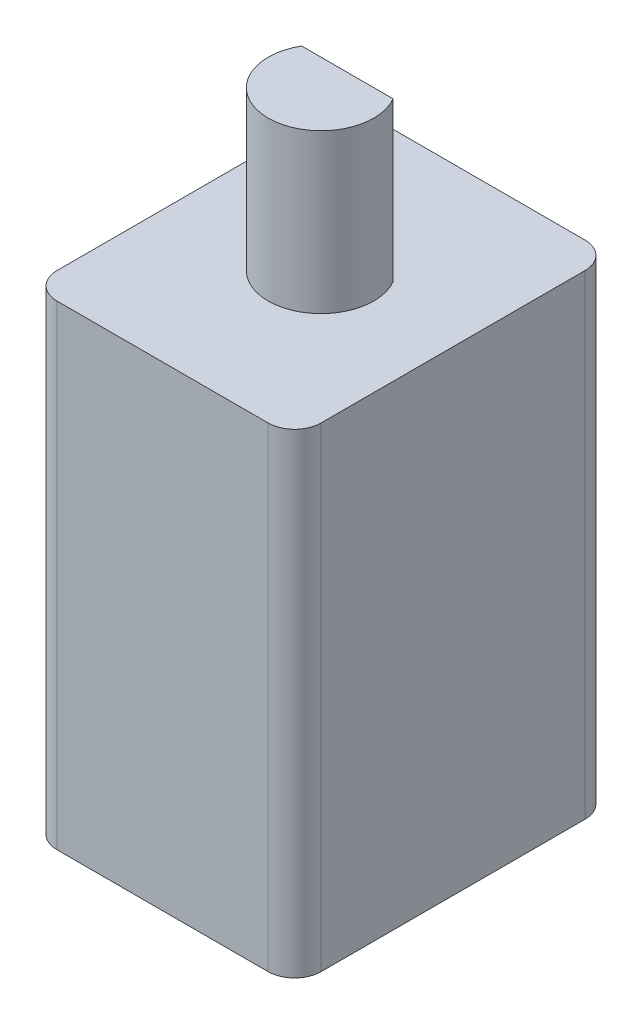
ISO-10303-21;
HEADER;
FILE_DESCRIPTION(('STEP AP214'),'2;1');
FILE_NAME('part.step','',(''),(''),'','','');
FILE_SCHEMA(('AUTOMOTIVE_DESIGN { 1 0 10303 214 1 1 1 1 }'));
ENDSEC;
DATA;
#1=APPLICATION_CONTEXT('core data for automotive mechanical design processes');
#2=APPLICATION_PROTOCOL_DEFINITION('international standard','automotive_design',2000,#1);
#3=PRODUCT_CONTEXT('',#1,'mechanical');
#4=PRODUCT('Part','Part','',(#3));
#5=PRODUCT_RELATED_PRODUCT_CATEGORY('part','',(#4));
#6=PRODUCT_DEFINITION_FORMATION('','',#4);
#7=PRODUCT_DEFINITION_CONTEXT('part definition',#1,'design');
#8=PRODUCT_DEFINITION('design','',#6,#7);
#9=PRODUCT_DEFINITION_SHAPE('','',#8);
#10=(LENGTH_UNIT() NAMED_UNIT(*) SI_UNIT(.MILLI.,.METRE.));
#11=(NAMED_UNIT(*) PLANE_ANGLE_UNIT() SI_UNIT($,.RADIAN.));
#12=(NAMED_UNIT(*) SI_UNIT($,.STERADIAN.) SOLID_ANGLE_UNIT());
#13=UNCERTAINTY_MEASURE_WITH_UNIT(LENGTH_MEASURE(1.E-05),#10,'distance_accuracy_value','');
#14=(GEOMETRIC_REPRESENTATION_CONTEXT(3) GLOBAL_UNCERTAINTY_ASSIGNED_CONTEXT((#13)) GLOBAL_UNIT_ASSIGNED_CONTEXT((#10,
#11,#12)) REPRESENTATION_CONTEXT('',''));
#15=CARTESIAN_POINT('',(0.,0.,0.));
#16=DIRECTION('',(0.,0.,1.));
#17=DIRECTION('',(1.,0.,0.));
#18=AXIS2_PLACEMENT_3D('',#15,#16,#17);
#19=CARTESIAN_POINT('',(0.,18.,0.));
#20=DIRECTION('',(0.,1.,0.));
#21=DIRECTION('',(0.,0.,1.));
#22=AXIS2_PLACEMENT_3D('',#19,#20,#21);
#23=PLANE('',#22);
#24=DIRECTION('',(-1.,0.,0.));
#25=VECTOR('',#24,1.);
#26=CARTESIAN_POINT('',(-5.,18.,-6.));
#27=LINE('',#26,#25);
#28=CARTESIAN_POINT('',(4.,18.,-6.));
#29=VERTEX_POINT('',#28);
#30=CARTESIAN_POINT('',(-4.,18.,-6.));
#31=VERTEX_POINT('',#30);
#32=EDGE_CURVE('E146',#29,#31,#27,.T.);
#33=ORIENTED_EDGE('',*,*,#32,.T.);
#34=CARTESIAN_POINT('',(-4.,18.,-5.));
#35=DIRECTION('',(0.,1.,0.));
#36=DIRECTION('',(0.,0.,1.));
#37=AXIS2_PLACEMENT_3D('',#34,#35,#36);
#38=CIRCLE('',#37,1.);
#39=CARTESIAN_POINT('',(-5.,18.,-5.));
#40=VERTEX_POINT('',#39);
#41=EDGE_CURVE('E183',#31,#40,#38,.T.);
#42=ORIENTED_EDGE('',*,*,#41,.T.);
#43=DIRECTION('',(0.,0.,1.));
#44=VECTOR('',#43,1.);
#45=CARTESIAN_POINT('',(-5.,18.,-6.));
#46=LINE('',#45,#44);
#47=CARTESIAN_POINT('',(-5.,18.,5.));
#48=VERTEX_POINT('',#47);
#49=EDGE_CURVE('E150',#40,#48,#46,.T.);
#50=ORIENTED_EDGE('',*,*,#49,.T.);
#51=CARTESIAN_POINT('',(-4.,18.,5.));
#52=DIRECTION('',(0.,1.,0.));
#53=DIRECTION('',(0.,0.,1.));
#54=AXIS2_PLACEMENT_3D('',#51,#52,#53);
#55=CIRCLE('',#54,1.);
#56=CARTESIAN_POINT('',(-4.,18.,6.));
#57=VERTEX_POINT('',#56);
#58=EDGE_CURVE('E59',#48,#57,#55,.T.);
#59=ORIENTED_EDGE('',*,*,#58,.T.);
#60=DIRECTION('',(1.,0.,0.));
#61=VECTOR('',#60,1.);
#62=CARTESIAN_POINT('',(-5.,18.,6.));
#63=LINE('',#62,#61);
#64=CARTESIAN_POINT('',(4.,18.,6.));
#65=VERTEX_POINT('',#64);
#66=EDGE_CURVE('E152',#57,#65,#63,.T.);
#67=ORIENTED_EDGE('',*,*,#66,.T.);
#68=CARTESIAN_POINT('',(4.,18.,5.));
#69=DIRECTION('',(0.,1.,0.));
#70=DIRECTION('',(0.,0.,1.));
#71=AXIS2_PLACEMENT_3D('',#68,#69,#70);
#72=CIRCLE('',#71,1.);
#73=CARTESIAN_POINT('',(5.,18.,5.));
#74=VERTEX_POINT('',#73);
#75=EDGE_CURVE('E178',#65,#74,#72,.T.);
#76=ORIENTED_EDGE('',*,*,#75,.T.);
#77=DIRECTION('',(0.,0.,-1.));
#78=VECTOR('',#77,1.);
#79=CARTESIAN_POINT('',(5.,18.,-6.));
#80=LINE('',#79,#78);
#81=CARTESIAN_POINT('',(5.,18.,-5.));
#82=VERTEX_POINT('',#81);
#83=EDGE_CURVE('E143',#74,#82,#80,.T.);
#84=ORIENTED_EDGE('',*,*,#83,.T.);
#85=CARTESIAN_POINT('',(4.,18.,-5.));
#86=DIRECTION('',(0.,1.,0.));
#87=DIRECTION('',(0.,0.,1.));
#88=AXIS2_PLACEMENT_3D('',#85,#86,#87);
#89=CIRCLE('',#88,1.);
#90=EDGE_CURVE('E181',#82,#29,#89,.T.);
#91=ORIENTED_EDGE('',*,*,#90,.T.);
#92=EDGE_LOOP('',(#33,#42,#50,#59,#67,#76,#84,#91));
#93=FACE_BOUND('',#92,.T.);
#94=DIRECTION('',(-1.,0.,0.));
#95=VECTOR('',#94,1.);
#96=CARTESIAN_POINT('',(-1.73205080756888,18.,-1.));
#97=LINE('',#96,#95);
#98=CARTESIAN_POINT('',(1.73205080756888,18.,-1.));
#99=VERTEX_POINT('',#98);
#100=CARTESIAN_POINT('',(-1.73205080756888,18.,-1.));
#101=VERTEX_POINT('',#100);
#102=EDGE_CURVE('E130',#99,#101,#97,.T.);
#103=ORIENTED_EDGE('',*,*,#102,.F.);
#104=CARTESIAN_POINT('',(0.,18.,0.));
#105=DIRECTION('',(0.,1.,0.));
#106=DIRECTION('',(0.,0.,1.));
#107=AXIS2_PLACEMENT_3D('',#104,#105,#106);
#108=CIRCLE('',#107,2.);
#109=EDGE_CURVE('E134',#101,#99,#108,.T.);
#110=ORIENTED_EDGE('',*,*,#109,.F.);
#111=EDGE_LOOP('',(#103,#110));
#112=FACE_BOUND('',#111,.T.);
#113=ADVANCED_FACE('F38',(#93,#112),#23,.T.);
#114=CARTESIAN_POINT('',(5.,18.,-6.));
#115=DIRECTION('',(-1.,0.,0.));
#116=DIRECTION('',(0.,0.,1.));
#117=AXIS2_PLACEMENT_3D('',#114,#115,#116);
#118=PLANE('',#117);
#119=DIRECTION('',(0.,0.,-1.));
#120=VECTOR('',#119,1.);
#121=CARTESIAN_POINT('',(5.,0.,-6.));
#122=LINE('',#121,#120);
#123=CARTESIAN_POINT('',(5.,0.,5.));
#124=VERTEX_POINT('',#123);
#125=CARTESIAN_POINT('',(5.,0.,-5.));
#126=VERTEX_POINT('',#125);
#127=EDGE_CURVE('E135',#124,#126,#122,.T.);
#128=ORIENTED_EDGE('',*,*,#127,.T.);
#129=DIRECTION('',(0.,-1.,0.));
#130=VECTOR('',#129,1.);
#131=CARTESIAN_POINT('',(5.,18.,-5.));
#132=LINE('',#131,#130);
#133=EDGE_CURVE('E188',#126,#82,#132,.F.);
#134=ORIENTED_EDGE('',*,*,#133,.T.);
#135=ORIENTED_EDGE('',*,*,#83,.F.);
#136=DIRECTION('',(0.,-1.,0.));
#137=VECTOR('',#136,1.);
#138=CARTESIAN_POINT('',(5.,18.,5.));
#139=LINE('',#138,#137);
#140=EDGE_CURVE('E185',#74,#124,#139,.T.);
#141=ORIENTED_EDGE('',*,*,#140,.T.);
#142=EDGE_LOOP('',(#128,#134,#135,#141));
#143=FACE_BOUND('',#142,.T.);
#144=ADVANCED_FACE('F192',(#143),#118,.F.);
#145=CARTESIAN_POINT('',(-5.,18.,-6.));
#146=DIRECTION('',(0.,0.,1.));
#147=DIRECTION('',(1.,0.,0.));
#148=AXIS2_PLACEMENT_3D('',#145,#146,#147);
#149=PLANE('',#148);
#150=DIRECTION('',(-1.,0.,0.));
#151=VECTOR('',#150,1.);
#152=CARTESIAN_POINT('',(-5.,0.,-6.));
#153=LINE('',#152,#151);
#154=CARTESIAN_POINT('',(4.,0.,-6.));
#155=VERTEX_POINT('',#154);
#156=CARTESIAN_POINT('',(-4.,0.,-6.));
#157=VERTEX_POINT('',#156);
#158=EDGE_CURVE('E138',#155,#157,#153,.T.);
#159=ORIENTED_EDGE('',*,*,#158,.T.);
#160=DIRECTION('',(0.,-1.,0.));
#161=VECTOR('',#160,1.);
#162=CARTESIAN_POINT('',(-4.,18.,-6.));
#163=LINE('',#162,#161);
#164=EDGE_CURVE('E176',#157,#31,#163,.F.);
#165=ORIENTED_EDGE('',*,*,#164,.T.);
#166=ORIENTED_EDGE('',*,*,#32,.F.);
#167=DIRECTION('',(0.,-1.,0.));
#168=VECTOR('',#167,1.);
#169=CARTESIAN_POINT('',(4.,18.,-6.));
#170=LINE('',#169,#168);
#171=EDGE_CURVE('E173',#29,#155,#170,.T.);
#172=ORIENTED_EDGE('',*,*,#171,.T.);
#173=EDGE_LOOP('',(#159,#165,#166,#172));
#174=FACE_BOUND('',#173,.T.);
#175=ADVANCED_FACE('F204',(#174),#149,.F.);
#176=CARTESIAN_POINT('',(-5.,18.,-6.));
#177=DIRECTION('',(1.,0.,0.));
#178=DIRECTION('',(0.,0.,-1.));
#179=AXIS2_PLACEMENT_3D('',#176,#177,#178);
#180=PLANE('',#179);
#181=ORIENTED_EDGE('',*,*,#49,.F.);
#182=DIRECTION('',(0.,-1.,0.));
#183=VECTOR('',#182,1.);
#184=CARTESIAN_POINT('',(-5.,18.,-5.));
#185=LINE('',#184,#183);
#186=CARTESIAN_POINT('',(-5.,0.,-5.));
#187=VERTEX_POINT('',#186);
#188=EDGE_CURVE('E162',#40,#187,#185,.T.);
#189=ORIENTED_EDGE('',*,*,#188,.T.);
#190=DIRECTION('',(0.,0.,1.));
#191=VECTOR('',#190,1.);
#192=CARTESIAN_POINT('',(-5.,0.,-6.));
#193=LINE('',#192,#191);
#194=CARTESIAN_POINT('',(-5.,0.,5.));
#195=VERTEX_POINT('',#194);
#196=EDGE_CURVE('E157',#187,#195,#193,.T.);
#197=ORIENTED_EDGE('',*,*,#196,.T.);
#198=DIRECTION('',(0.,-1.,0.));
#199=VECTOR('',#198,1.);
#200=CARTESIAN_POINT('',(-5.,18.,5.));
#201=LINE('',#200,#199);
#202=EDGE_CURVE('E153',#195,#48,#201,.F.);
#203=ORIENTED_EDGE('',*,*,#202,.T.);
#204=EDGE_LOOP('',(#181,#189,#197,#203));
#205=FACE_BOUND('',#204,.T.);
#206=ADVANCED_FACE('F215',(#205),#180,.F.);
#207=CARTESIAN_POINT('',(-5.,18.,6.));
#208=DIRECTION('',(0.,0.,-1.));
#209=DIRECTION('',(-1.,0.,0.));
#210=AXIS2_PLACEMENT_3D('',#207,#208,#209);
#211=PLANE('',#210);
#212=ORIENTED_EDGE('',*,*,#66,.F.);
#213=DIRECTION('',(0.,-1.,0.));
#214=VECTOR('',#213,1.);
#215=CARTESIAN_POINT('',(-4.,18.,6.));
#216=LINE('',#215,#214);
#217=CARTESIAN_POINT('',(-4.,0.,6.));
#218=VERTEX_POINT('',#217);
#219=EDGE_CURVE('E11',#57,#218,#216,.T.);
#220=ORIENTED_EDGE('',*,*,#219,.T.);
#221=DIRECTION('',(1.,0.,0.));
#222=VECTOR('',#221,1.);
#223=CARTESIAN_POINT('',(-5.,0.,6.));
#224=LINE('',#223,#222);
#225=CARTESIAN_POINT('',(4.,0.,6.));
#226=VERTEX_POINT('',#225);
#227=EDGE_CURVE('E147',#218,#226,#224,.T.);
#228=ORIENTED_EDGE('',*,*,#227,.T.);
#229=DIRECTION('',(0.,-1.,0.));
#230=VECTOR('',#229,1.);
#231=CARTESIAN_POINT('',(4.,18.,6.));
#232=LINE('',#231,#230);
#233=EDGE_CURVE('E46',#226,#65,#232,.F.);
#234=ORIENTED_EDGE('',*,*,#233,.T.);
#235=EDGE_LOOP('',(#212,#220,#228,#234));
#236=FACE_BOUND('',#235,.T.);
#237=ADVANCED_FACE('F221',(#236),#211,.F.);
#238=CARTESIAN_POINT('',(0.,0.,0.));
#239=DIRECTION('',(0.,1.,0.));
#240=DIRECTION('',(0.,0.,1.));
#241=AXIS2_PLACEMENT_3D('',#238,#239,#240);
#242=PLANE('',#241);
#243=ORIENTED_EDGE('',*,*,#196,.F.);
#244=CARTESIAN_POINT('',(-4.,0.,-5.));
#245=DIRECTION('',(0.,1.,0.));
#246=DIRECTION('',(0.,0.,1.));
#247=AXIS2_PLACEMENT_3D('',#244,#245,#246);
#248=CIRCLE('',#247,1.);
#249=EDGE_CURVE('E171',#187,#157,#248,.F.);
#250=ORIENTED_EDGE('',*,*,#249,.T.);
#251=ORIENTED_EDGE('',*,*,#158,.F.);
#252=CARTESIAN_POINT('',(4.,0.,-5.));
#253=DIRECTION('',(0.,1.,0.));
#254=DIRECTION('',(0.,0.,1.));
#255=AXIS2_PLACEMENT_3D('',#252,#253,#254);
#256=CIRCLE('',#255,1.);
#257=EDGE_CURVE('E169',#155,#126,#256,.F.);
#258=ORIENTED_EDGE('',*,*,#257,.T.);
#259=ORIENTED_EDGE('',*,*,#127,.F.);
#260=CARTESIAN_POINT('',(4.,0.,5.));
#261=DIRECTION('',(0.,1.,0.));
#262=DIRECTION('',(0.,0.,1.));
#263=AXIS2_PLACEMENT_3D('',#260,#261,#262);
#264=CIRCLE('',#263,1.);
#265=EDGE_CURVE('E165',#124,#226,#264,.F.);
#266=ORIENTED_EDGE('',*,*,#265,.T.);
#267=ORIENTED_EDGE('',*,*,#227,.F.);
#268=CARTESIAN_POINT('',(-4.,0.,5.));
#269=DIRECTION('',(0.,1.,0.));
#270=DIRECTION('',(0.,0.,1.));
#271=AXIS2_PLACEMENT_3D('',#268,#269,#270);
#272=CIRCLE('',#271,1.);
#273=EDGE_CURVE('E167',#218,#195,#272,.F.);
#274=ORIENTED_EDGE('',*,*,#273,.T.);
#275=EDGE_LOOP('',(#243,#250,#251,#258,#259,#266,#267,#274));
#276=FACE_BOUND('',#275,.T.);
#277=ADVANCED_FACE('F208',(#276),#242,.F.);
#278=CARTESIAN_POINT('',(0.,24.,0.));
#279=DIRECTION('',(0.,-1.,0.));
#280=DIRECTION('',(0.,0.,-1.));
#281=AXIS2_PLACEMENT_3D('',#278,#279,#280);
#282=CYLINDRICAL_SURFACE('',#281,2.);
#283=ORIENTED_EDGE('',*,*,#109,.T.);
#284=DIRECTION('',(0.,-1.,0.));
#285=VECTOR('',#284,1.);
#286=CARTESIAN_POINT('',(1.73205080756888,24.,-1.));
#287=LINE('',#286,#285);
#288=CARTESIAN_POINT('',(1.73205080756888,24.,-1.));
#289=VERTEX_POINT('',#288);
#290=EDGE_CURVE('E120',#289,#99,#287,.T.);
#291=ORIENTED_EDGE('',*,*,#290,.F.);
#292=CARTESIAN_POINT('',(0.,24.,0.));
#293=DIRECTION('',(0.,1.,0.));
#294=DIRECTION('',(0.,0.,1.));
#295=AXIS2_PLACEMENT_3D('',#292,#293,#294);
#296=CIRCLE('',#295,2.);
#297=CARTESIAN_POINT('',(-1.73205080756888,24.,-1.));
#298=VERTEX_POINT('',#297);
#299=EDGE_CURVE('E126',#298,#289,#296,.T.);
#300=ORIENTED_EDGE('',*,*,#299,.F.);
#301=DIRECTION('',(0.,-1.,0.));
#302=VECTOR('',#301,1.);
#303=CARTESIAN_POINT('',(-1.73205080756888,24.,-1.));
#304=LINE('',#303,#302);
#305=EDGE_CURVE('E123',#298,#101,#304,.T.);
#306=ORIENTED_EDGE('',*,*,#305,.T.);
#307=EDGE_LOOP('',(#283,#291,#300,#306));
#308=FACE_BOUND('',#307,.T.);
#309=ADVANCED_FACE('F132',(#308),#282,.T.);
#310=CARTESIAN_POINT('',(-1.73205080756888,24.,-1.));
#311=DIRECTION('',(0.,0.,1.));
#312=DIRECTION('',(1.,0.,0.));
#313=AXIS2_PLACEMENT_3D('',#310,#311,#312);
#314=PLANE('',#313);
#315=ORIENTED_EDGE('',*,*,#102,.T.);
#316=ORIENTED_EDGE('',*,*,#305,.F.);
#317=DIRECTION('',(-1.,0.,0.));
#318=VECTOR('',#317,1.);
#319=CARTESIAN_POINT('',(-1.73205080756888,24.,-1.));
#320=LINE('',#319,#318);
#321=EDGE_CURVE('E116',#289,#298,#320,.T.);
#322=ORIENTED_EDGE('',*,*,#321,.F.);
#323=ORIENTED_EDGE('',*,*,#290,.T.);
#324=EDGE_LOOP('',(#315,#316,#322,#323));
#325=FACE_BOUND('',#324,.T.);
#326=ADVANCED_FACE('F118',(#325),#314,.F.);
#327=CARTESIAN_POINT('',(0.,24.,0.));
#328=DIRECTION('',(0.,1.,0.));
#329=DIRECTION('',(0.,0.,1.));
#330=AXIS2_PLACEMENT_3D('',#327,#328,#329);
#331=PLANE('',#330);
#332=ORIENTED_EDGE('',*,*,#299,.T.);
#333=ORIENTED_EDGE('',*,*,#321,.T.);
#334=EDGE_LOOP('',(#332,#333));
#335=FACE_BOUND('',#334,.T.);
#336=ADVANCED_FACE('F128',(#335),#331,.T.);
#337=CARTESIAN_POINT('',(-4.,18.,-5.));
#338=DIRECTION('',(0.,-1.,0.));
#339=DIRECTION('',(0.,0.,-1.));
#340=AXIS2_PLACEMENT_3D('',#337,#338,#339);
#341=CYLINDRICAL_SURFACE('',#340,1.);
#342=ORIENTED_EDGE('',*,*,#41,.F.);
#343=ORIENTED_EDGE('',*,*,#164,.F.);
#344=ORIENTED_EDGE('',*,*,#249,.F.);
#345=ORIENTED_EDGE('',*,*,#188,.F.);
#346=EDGE_LOOP('',(#342,#343,#344,#345));
#347=FACE_BOUND('',#346,.T.);
#348=ADVANCED_FACE('F212',(#347),#341,.T.);
#349=CARTESIAN_POINT('',(4.,18.,-5.));
#350=DIRECTION('',(0.,-1.,0.));
#351=DIRECTION('',(0.,0.,-1.));
#352=AXIS2_PLACEMENT_3D('',#349,#350,#351);
#353=CYLINDRICAL_SURFACE('',#352,1.);
#354=ORIENTED_EDGE('',*,*,#90,.F.);
#355=ORIENTED_EDGE('',*,*,#133,.F.);
#356=ORIENTED_EDGE('',*,*,#257,.F.);
#357=ORIENTED_EDGE('',*,*,#171,.F.);
#358=EDGE_LOOP('',(#354,#355,#356,#357));
#359=FACE_BOUND('',#358,.T.);
#360=ADVANCED_FACE('F201',(#359),#353,.T.);
#361=CARTESIAN_POINT('',(-4.,18.,5.));
#362=DIRECTION('',(0.,-1.,0.));
#363=DIRECTION('',(0.,0.,-1.));
#364=AXIS2_PLACEMENT_3D('',#361,#362,#363);
#365=CYLINDRICAL_SURFACE('',#364,1.);
#366=ORIENTED_EDGE('',*,*,#58,.F.);
#367=ORIENTED_EDGE('',*,*,#202,.F.);
#368=ORIENTED_EDGE('',*,*,#273,.F.);
#369=ORIENTED_EDGE('',*,*,#219,.F.);
#370=EDGE_LOOP('',(#366,#367,#368,#369));
#371=FACE_BOUND('',#370,.T.);
#372=ADVANCED_FACE('F219',(#371),#365,.T.);
#373=CARTESIAN_POINT('',(4.,18.,5.));
#374=DIRECTION('',(0.,-1.,0.));
#375=DIRECTION('',(0.,0.,-1.));
#376=AXIS2_PLACEMENT_3D('',#373,#374,#375);
#377=CYLINDRICAL_SURFACE('',#376,1.);
#378=ORIENTED_EDGE('',*,*,#75,.F.);
#379=ORIENTED_EDGE('',*,*,#233,.F.);
#380=ORIENTED_EDGE('',*,*,#265,.F.);
#381=ORIENTED_EDGE('',*,*,#140,.F.);
#382=EDGE_LOOP('',(#378,#379,#380,#381));
#383=FACE_BOUND('',#382,.T.);
#384=ADVANCED_FACE('F40',(#383),#377,.T.);
#385=CLOSED_SHELL('',(#113,#144,#175,#206,#237,#277,#309,#326,#336,#348,#360,#372,#384));
#386=MANIFOLD_SOLID_BREP('B2',#385);
#387=ADVANCED_BREP_SHAPE_REPRESENTATION('',(#18,#386),#14);
#388=SHAPE_DEFINITION_REPRESENTATION(#9,#387);
ENDSEC;
END-ISO-10303-21;
